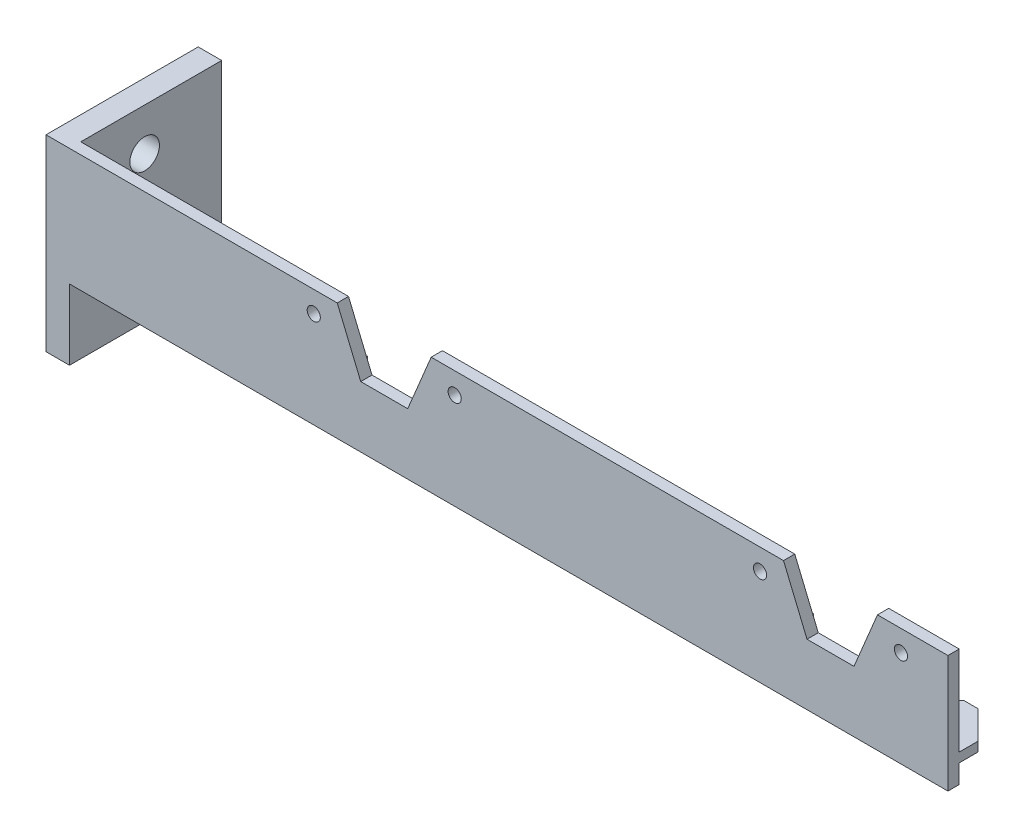
ISO-10303-21;
HEADER;
FILE_DESCRIPTION(('STEP AP214'),'2;1');
FILE_NAME('part.step','',(''),(''),'','','');
FILE_SCHEMA(('AUTOMOTIVE_DESIGN { 1 0 10303 214 1 1 1 1 }'));
ENDSEC;
DATA;
#1=APPLICATION_CONTEXT('core data for automotive mechanical design processes');
#2=APPLICATION_PROTOCOL_DEFINITION('international standard','automotive_design',2000,#1);
#3=PRODUCT_CONTEXT('',#1,'mechanical');
#4=PRODUCT('Part','Part','',(#3));
#5=PRODUCT_RELATED_PRODUCT_CATEGORY('part','',(#4));
#6=PRODUCT_DEFINITION_FORMATION('','',#4);
#7=PRODUCT_DEFINITION_CONTEXT('part definition',#1,'design');
#8=PRODUCT_DEFINITION('design','',#6,#7);
#9=PRODUCT_DEFINITION_SHAPE('','',#8);
#10=(LENGTH_UNIT() NAMED_UNIT(*) SI_UNIT(.MILLI.,.METRE.));
#11=(NAMED_UNIT(*) PLANE_ANGLE_UNIT() SI_UNIT($,.RADIAN.));
#12=(NAMED_UNIT(*) SI_UNIT($,.STERADIAN.) SOLID_ANGLE_UNIT());
#13=UNCERTAINTY_MEASURE_WITH_UNIT(LENGTH_MEASURE(1.E-05),#10,'distance_accuracy_value','');
#14=(GEOMETRIC_REPRESENTATION_CONTEXT(3) GLOBAL_UNCERTAINTY_ASSIGNED_CONTEXT((#13)) GLOBAL_UNIT_ASSIGNED_CONTEXT((#10,
#11,#12)) REPRESENTATION_CONTEXT('',''));
#15=CARTESIAN_POINT('',(0.,0.,0.));
#16=DIRECTION('',(0.,0.,1.));
#17=DIRECTION('',(1.,0.,0.));
#18=AXIS2_PLACEMENT_3D('',#15,#16,#17);
#19=CARTESIAN_POINT('',(202.198039027186,5.99999999999997,-10.));
#20=DIRECTION('',(0.,-1.,0.));
#21=DIRECTION('',(1.,0.,0.));
#22=AXIS2_PLACEMENT_3D('',#19,#20,#21);
#23=PLANE('',#22);
#24=DIRECTION('',(0.,0.,-1.));
#25=VECTOR('',#24,1.);
#26=CARTESIAN_POINT('',(62.,5.99999999999999,-10.));
#27=LINE('',#26,#25);
#28=CARTESIAN_POINT('',(62.,5.99999999999999,0.));
#29=VERTEX_POINT('',#28);
#30=CARTESIAN_POINT('',(62.,5.99999999999999,-3.99999999999999));
#31=VERTEX_POINT('',#30);
#32=EDGE_CURVE('E323',#29,#31,#27,.T.);
#33=ORIENTED_EDGE('',*,*,#32,.T.);
#34=DIRECTION('',(0.707106781186548,0.,0.707106781186548));
#35=VECTOR('',#34,1.);
#36=CARTESIAN_POINT('',(56.,5.99999999999997,-10.));
#37=LINE('',#36,#35);
#38=CARTESIAN_POINT('',(56.,5.99999999999999,-10.));
#39=VERTEX_POINT('',#38);
#40=EDGE_CURVE('E11',#31,#39,#37,.F.);
#41=ORIENTED_EDGE('',*,*,#40,.T.);
#42=DIRECTION('',(-1.,0.,0.));
#43=VECTOR('',#42,1.);
#44=CARTESIAN_POINT('',(202.198039027186,5.99999999999997,-10.));
#45=LINE('',#44,#43);
#46=CARTESIAN_POINT('',(5.,6.,-10.));
#47=VERTEX_POINT('',#46);
#48=EDGE_CURVE('E300',#39,#47,#45,.T.);
#49=ORIENTED_EDGE('',*,*,#48,.T.);
#50=DIRECTION('',(0.,0.,1.));
#51=VECTOR('',#50,1.);
#52=CARTESIAN_POINT('',(5.,6.,-10.));
#53=LINE('',#52,#51);
#54=CARTESIAN_POINT('',(5.,6.,0.));
#55=VERTEX_POINT('',#54);
#56=EDGE_CURVE('E312',#47,#55,#53,.T.);
#57=ORIENTED_EDGE('',*,*,#56,.T.);
#58=DIRECTION('',(-1.,0.,0.));
#59=VECTOR('',#58,1.);
#60=CARTESIAN_POINT('',(202.198039027186,5.99999999999997,0.));
#61=LINE('',#60,#59);
#62=EDGE_CURVE('E309',#29,#55,#61,.T.);
#63=ORIENTED_EDGE('',*,*,#62,.F.);
#64=EDGE_LOOP('',(#33,#41,#49,#57,#63));
#65=FACE_BOUND('',#64,.T.);
#66=ADVANCED_FACE('F35',(#65),#23,.F.);
#67=DIRECTION('',(0.,0.,-1.));
#68=VECTOR('',#67,1.);
#69=CARTESIAN_POINT('',(157.,5.99999999999998,-10.));
#70=LINE('',#69,#68);
#71=CARTESIAN_POINT('',(157.,5.99999999999998,0.));
#72=VERTEX_POINT('',#71);
#73=CARTESIAN_POINT('',(157.,5.99999999999998,-3.99999999999994));
#74=VERTEX_POINT('',#73);
#75=EDGE_CURVE('E329',#72,#74,#70,.T.);
#76=ORIENTED_EDGE('',*,*,#75,.T.);
#77=DIRECTION('',(0.707106781186546,0.,0.707106781186549));
#78=VECTOR('',#77,1.);
#79=CARTESIAN_POINT('',(151.,5.99999999999997,-10.));
#80=LINE('',#79,#78);
#81=CARTESIAN_POINT('',(151.,5.99999999999998,-10.));
#82=VERTEX_POINT('',#81);
#83=EDGE_CURVE('E349',#74,#82,#80,.F.);
#84=ORIENTED_EDGE('',*,*,#83,.T.);
#85=CARTESIAN_POINT('',(88.,5.99999999999999,-10.));
#86=VERTEX_POINT('',#85);
#87=EDGE_CURVE('E299',#82,#86,#45,.T.);
#88=ORIENTED_EDGE('',*,*,#87,.T.);
#89=DIRECTION('',(0.707106781186544,0.,-0.707106781186551));
#90=VECTOR('',#89,1.);
#91=CARTESIAN_POINT('',(88.,5.99999999999997,-10.));
#92=LINE('',#91,#90);
#93=CARTESIAN_POINT('',(82.,5.99999999999999,-3.99999999999994));
#94=VERTEX_POINT('',#93);
#95=EDGE_CURVE('E353',#86,#94,#92,.F.);
#96=ORIENTED_EDGE('',*,*,#95,.T.);
#97=DIRECTION('',(0.,0.,1.));
#98=VECTOR('',#97,1.);
#99=CARTESIAN_POINT('',(82.,5.99999999999999,-10.));
#100=LINE('',#99,#98);
#101=CARTESIAN_POINT('',(82.,5.99999999999998,0.));
#102=VERTEX_POINT('',#101);
#103=EDGE_CURVE('E327',#94,#102,#100,.T.);
#104=ORIENTED_EDGE('',*,*,#103,.T.);
#105=EDGE_CURVE('E308',#72,#102,#61,.T.);
#106=ORIENTED_EDGE('',*,*,#105,.F.);
#107=EDGE_LOOP('',(#76,#84,#88,#96,#104,#106));
#108=FACE_BOUND('',#107,.T.);
#109=ADVANCED_FACE('F593',(#108),#23,.F.);
#110=CARTESIAN_POINT('',(202.198039027186,5.99999999999997,-10.));
#111=DIRECTION('',(0.,0.,1.));
#112=DIRECTION('',(0.,-1.,0.));
#113=AXIS2_PLACEMENT_3D('',#110,#111,#112);
#114=PLANE('',#113);
#115=ORIENTED_EDGE('',*,*,#48,.F.);
#116=DIRECTION('',(0.,-1.,0.));
#117=VECTOR('',#116,1.);
#118=CARTESIAN_POINT('',(56.,5.99999999999997,-10.));
#119=LINE('',#118,#117);
#120=CARTESIAN_POINT('',(56.,3.99999999999999,-10.));
#121=VERTEX_POINT('',#120);
#122=EDGE_CURVE('E345',#39,#121,#119,.T.);
#123=ORIENTED_EDGE('',*,*,#122,.T.);
#124=DIRECTION('',(-1.,0.,0.));
#125=VECTOR('',#124,1.);
#126=CARTESIAN_POINT('',(202.198039027186,3.99999999999997,-10.));
#127=LINE('',#126,#125);
#128=CARTESIAN_POINT('',(5.,4.,-10.));
#129=VERTEX_POINT('',#128);
#130=EDGE_CURVE('E286',#121,#129,#127,.T.);
#131=ORIENTED_EDGE('',*,*,#130,.T.);
#132=DIRECTION('',(0.,1.,0.));
#133=VECTOR('',#132,1.);
#134=CARTESIAN_POINT('',(5.,6.,-10.));
#135=LINE('',#134,#133);
#136=EDGE_CURVE('E316',#129,#47,#135,.T.);
#137=ORIENTED_EDGE('',*,*,#136,.T.);
#138=EDGE_LOOP('',(#115,#123,#131,#137));
#139=FACE_BOUND('',#138,.T.);
#140=ADVANCED_FACE('F599',(#139),#114,.F.);
#141=ORIENTED_EDGE('',*,*,#87,.F.);
#142=DIRECTION('',(0.,-1.,0.));
#143=VECTOR('',#142,1.);
#144=CARTESIAN_POINT('',(151.,5.99999999999997,-10.));
#145=LINE('',#144,#143);
#146=CARTESIAN_POINT('',(151.,3.99999999999998,-10.));
#147=VERTEX_POINT('',#146);
#148=EDGE_CURVE('E361',#82,#147,#145,.T.);
#149=ORIENTED_EDGE('',*,*,#148,.T.);
#150=CARTESIAN_POINT('',(88.,3.99999999999999,-10.));
#151=VERTEX_POINT('',#150);
#152=EDGE_CURVE('E285',#147,#151,#127,.T.);
#153=ORIENTED_EDGE('',*,*,#152,.T.);
#154=DIRECTION('',(0.,1.,0.));
#155=VECTOR('',#154,1.);
#156=CARTESIAN_POINT('',(88.,5.99999999999997,-10.));
#157=LINE('',#156,#155);
#158=EDGE_CURVE('E364',#151,#86,#157,.T.);
#159=ORIENTED_EDGE('',*,*,#158,.T.);
#160=EDGE_LOOP('',(#141,#149,#153,#159));
#161=FACE_BOUND('',#160,.T.);
#162=ADVANCED_FACE('F609',(#161),#114,.F.);
#163=CARTESIAN_POINT('',(202.198039027186,3.99999999999997,-10.));
#164=DIRECTION('',(0.,1.,0.));
#165=DIRECTION('',(0.,0.,1.));
#166=AXIS2_PLACEMENT_3D('',#163,#164,#165);
#167=PLANE('',#166);
#168=ORIENTED_EDGE('',*,*,#130,.F.);
#169=DIRECTION('',(-0.707106781186548,0.,-0.707106781186548));
#170=VECTOR('',#169,1.);
#171=CARTESIAN_POINT('',(56.,3.99999999999999,-10.));
#172=LINE('',#171,#170);
#173=CARTESIAN_POINT('',(62.,3.99999999999999,-4.));
#174=VERTEX_POINT('',#173);
#175=EDGE_CURVE('E58',#121,#174,#172,.F.);
#176=ORIENTED_EDGE('',*,*,#175,.T.);
#177=DIRECTION('',(0.,0.,1.));
#178=VECTOR('',#177,1.);
#179=CARTESIAN_POINT('',(62.,3.99999999999999,-10.));
#180=LINE('',#179,#178);
#181=CARTESIAN_POINT('',(62.,3.99999999999999,0.));
#182=VERTEX_POINT('',#181);
#183=EDGE_CURVE('E382',#174,#182,#180,.T.);
#184=ORIENTED_EDGE('',*,*,#183,.T.);
#185=DIRECTION('',(-1.,0.,0.));
#186=VECTOR('',#185,1.);
#187=CARTESIAN_POINT('',(202.198039027186,3.99999999999997,0.));
#188=LINE('',#187,#186);
#189=CARTESIAN_POINT('',(5.,3.99999999999997,0.));
#190=VERTEX_POINT('',#189);
#191=EDGE_CURVE('E275',#182,#190,#188,.T.);
#192=ORIENTED_EDGE('',*,*,#191,.T.);
#193=DIRECTION('',(0.,0.,-1.));
#194=VECTOR('',#193,1.);
#195=CARTESIAN_POINT('',(5.,4.,-10.));
#196=LINE('',#195,#194);
#197=EDGE_CURVE('E319',#190,#129,#196,.T.);
#198=ORIENTED_EDGE('',*,*,#197,.T.);
#199=EDGE_LOOP('',(#168,#176,#184,#192,#198));
#200=FACE_BOUND('',#199,.T.);
#201=ADVANCED_FACE('F828',(#200),#167,.F.);
#202=ORIENTED_EDGE('',*,*,#152,.F.);
#203=DIRECTION('',(-0.707106781186546,0.,-0.707106781186549));
#204=VECTOR('',#203,1.);
#205=CARTESIAN_POINT('',(151.,3.99999999999998,-10.));
#206=LINE('',#205,#204);
#207=CARTESIAN_POINT('',(157.,3.99999999999998,-3.99999999999994));
#208=VERTEX_POINT('',#207);
#209=EDGE_CURVE('E357',#147,#208,#206,.F.);
#210=ORIENTED_EDGE('',*,*,#209,.T.);
#211=DIRECTION('',(0.,0.,1.));
#212=VECTOR('',#211,1.);
#213=CARTESIAN_POINT('',(157.,3.99999999999998,-10.));
#214=LINE('',#213,#212);
#215=CARTESIAN_POINT('',(157.,3.99999999999998,0.));
#216=VERTEX_POINT('',#215);
#217=EDGE_CURVE('E254',#208,#216,#214,.T.);
#218=ORIENTED_EDGE('',*,*,#217,.T.);
#219=CARTESIAN_POINT('',(82.,3.99999999999999,0.));
#220=VERTEX_POINT('',#219);
#221=EDGE_CURVE('E273',#216,#220,#188,.T.);
#222=ORIENTED_EDGE('',*,*,#221,.T.);
#223=DIRECTION('',(0.,0.,-1.));
#224=VECTOR('',#223,1.);
#225=CARTESIAN_POINT('',(82.,3.99999999999999,-10.));
#226=LINE('',#225,#224);
#227=CARTESIAN_POINT('',(82.,3.99999999999999,-3.99999999999994));
#228=VERTEX_POINT('',#227);
#229=EDGE_CURVE('E384',#220,#228,#226,.T.);
#230=ORIENTED_EDGE('',*,*,#229,.T.);
#231=DIRECTION('',(-0.707106781186544,0.,0.707106781186551));
#232=VECTOR('',#231,1.);
#233=CARTESIAN_POINT('',(88.,3.99999999999999,-10.));
#234=LINE('',#233,#232);
#235=EDGE_CURVE('E359',#228,#151,#234,.F.);
#236=ORIENTED_EDGE('',*,*,#235,.T.);
#237=EDGE_LOOP('',(#202,#210,#218,#222,#230,#236));
#238=FACE_BOUND('',#237,.T.);
#239=ADVANCED_FACE('F664',(#238),#167,.F.);
#240=CARTESIAN_POINT('',(0.,0.,0.));
#241=DIRECTION('',(0.,0.,-1.));
#242=DIRECTION('',(-1.,0.,0.));
#243=AXIS2_PLACEMENT_3D('',#240,#241,#242);
#244=PLANE('',#243);
#245=ORIENTED_EDGE('',*,*,#105,.T.);
#246=DIRECTION('',(0.,1.,0.));
#247=VECTOR('',#246,1.);
#248=CARTESIAN_POINT('',(82.,-15.,0.));
#249=LINE('',#248,#247);
#250=EDGE_CURVE('E337',#220,#102,#249,.T.);
#251=ORIENTED_EDGE('',*,*,#250,.F.);
#252=ORIENTED_EDGE('',*,*,#221,.F.);
#253=DIRECTION('',(0.,1.,0.));
#254=VECTOR('',#253,1.);
#255=CARTESIAN_POINT('',(157.,-15.,0.));
#256=LINE('',#255,#254);
#257=EDGE_CURVE('E267',#216,#72,#256,.T.);
#258=ORIENTED_EDGE('',*,*,#257,.T.);
#259=EDGE_LOOP('',(#245,#251,#252,#258));
#260=FACE_BOUND('',#259,.T.);
#261=DIRECTION('',(0.,1.,0.));
#262=VECTOR('',#261,1.);
#263=CARTESIAN_POINT('',(192.,0.,0.));
#264=LINE('',#263,#262);
#265=CARTESIAN_POINT('',(192.,0.,0.));
#266=VERTEX_POINT('',#265);
#267=CARTESIAN_POINT('',(192.,3.99999999999997,0.));
#268=VERTEX_POINT('',#267);
#269=EDGE_CURVE('E413',#266,#268,#264,.T.);
#270=ORIENTED_EDGE('',*,*,#269,.F.);
#271=DIRECTION('',(1.,0.,0.));
#272=VECTOR('',#271,1.);
#273=CARTESIAN_POINT('',(0.,0.,0.));
#274=LINE('',#273,#272);
#275=CARTESIAN_POINT('',(5.,0.,0.));
#276=VERTEX_POINT('',#275);
#277=EDGE_CURVE('E416',#276,#266,#274,.T.);
#278=ORIENTED_EDGE('',*,*,#277,.F.);
#279=DIRECTION('',(0.,-1.,0.));
#280=VECTOR('',#279,1.);
#281=CARTESIAN_POINT('',(5.,0.,0.));
#282=LINE('',#281,#280);
#283=EDGE_CURVE('E397',#190,#276,#282,.T.);
#284=ORIENTED_EDGE('',*,*,#283,.F.);
#285=ORIENTED_EDGE('',*,*,#191,.F.);
#286=DIRECTION('',(0.,1.,0.));
#287=VECTOR('',#286,1.);
#288=CARTESIAN_POINT('',(62.,-15.,0.));
#289=LINE('',#288,#287);
#290=EDGE_CURVE('E333',#182,#29,#289,.T.);
#291=ORIENTED_EDGE('',*,*,#290,.T.);
#292=ORIENTED_EDGE('',*,*,#62,.T.);
#293=CARTESIAN_POINT('',(5.,25.,0.));
#294=VERTEX_POINT('',#293);
#295=EDGE_CURVE('E255',#294,#55,#282,.T.);
#296=ORIENTED_EDGE('',*,*,#295,.F.);
#297=DIRECTION('',(-1.,0.,0.));
#298=VECTOR('',#297,1.);
#299=CARTESIAN_POINT('',(0.,25.,0.));
#300=LINE('',#299,#298);
#301=CARTESIAN_POINT('',(62.,25.,0.));
#302=VERTEX_POINT('',#301);
#303=EDGE_CURVE('E412',#302,#294,#300,.T.);
#304=ORIENTED_EDGE('',*,*,#303,.F.);
#305=DIRECTION('',(0.384615384615384,-0.923076923076923,0.));
#306=VECTOR('',#305,1.);
#307=CARTESIAN_POINT('',(62.,25.,0.));
#308=LINE('',#307,#306);
#309=CARTESIAN_POINT('',(67.,13.,0.));
#310=VERTEX_POINT('',#309);
#311=EDGE_CURVE('E481',#302,#310,#308,.T.);
#312=ORIENTED_EDGE('',*,*,#311,.T.);
#313=DIRECTION('',(1.,0.,0.));
#314=VECTOR('',#313,1.);
#315=CARTESIAN_POINT('',(77.,13.,0.));
#316=LINE('',#315,#314);
#317=CARTESIAN_POINT('',(77.,13.,0.));
#318=VERTEX_POINT('',#317);
#319=EDGE_CURVE('E489',#310,#318,#316,.T.);
#320=ORIENTED_EDGE('',*,*,#319,.T.);
#321=DIRECTION('',(0.384615384615384,0.923076923076923,0.));
#322=VECTOR('',#321,1.);
#323=CARTESIAN_POINT('',(82.,25.,0.));
#324=LINE('',#323,#322);
#325=CARTESIAN_POINT('',(82.,25.,0.));
#326=VERTEX_POINT('',#325);
#327=EDGE_CURVE('E473',#318,#326,#324,.T.);
#328=ORIENTED_EDGE('',*,*,#327,.T.);
#329=CARTESIAN_POINT('',(157.,25.,0.));
#330=VERTEX_POINT('',#329);
#331=EDGE_CURVE('E411',#330,#326,#300,.T.);
#332=ORIENTED_EDGE('',*,*,#331,.F.);
#333=DIRECTION('',(0.384615384615385,-0.923076923076923,0.));
#334=VECTOR('',#333,1.);
#335=CARTESIAN_POINT('',(157.,25.,0.));
#336=LINE('',#335,#334);
#337=CARTESIAN_POINT('',(162.,13.,0.));
#338=VERTEX_POINT('',#337);
#339=EDGE_CURVE('E439',#330,#338,#336,.T.);
#340=ORIENTED_EDGE('',*,*,#339,.T.);
#341=DIRECTION('',(1.,0.,0.));
#342=VECTOR('',#341,1.);
#343=CARTESIAN_POINT('',(172.,13.,0.));
#344=LINE('',#343,#342);
#345=CARTESIAN_POINT('',(172.,13.,0.));
#346=VERTEX_POINT('',#345);
#347=EDGE_CURVE('E449',#338,#346,#344,.T.);
#348=ORIENTED_EDGE('',*,*,#347,.T.);
#349=DIRECTION('',(0.384615384615385,0.923076923076923,0.));
#350=VECTOR('',#349,1.);
#351=CARTESIAN_POINT('',(177.,25.,0.));
#352=LINE('',#351,#350);
#353=CARTESIAN_POINT('',(177.,25.,0.));
#354=VERTEX_POINT('',#353);
#355=EDGE_CURVE('E431',#346,#354,#352,.T.);
#356=ORIENTED_EDGE('',*,*,#355,.T.);
#357=CARTESIAN_POINT('',(192.,25.,0.));
#358=VERTEX_POINT('',#357);
#359=EDGE_CURVE('E407',#358,#354,#300,.T.);
#360=ORIENTED_EDGE('',*,*,#359,.F.);
#361=CARTESIAN_POINT('',(192.,5.99999999999997,0.));
#362=VERTEX_POINT('',#361);
#363=EDGE_CURVE('E415',#362,#358,#264,.T.);
#364=ORIENTED_EDGE('',*,*,#363,.F.);
#365=CARTESIAN_POINT('',(177.,5.99999999999997,0.));
#366=VERTEX_POINT('',#365);
#367=EDGE_CURVE('E266',#362,#366,#61,.T.);
#368=ORIENTED_EDGE('',*,*,#367,.T.);
#369=DIRECTION('',(0.,1.,0.));
#370=VECTOR('',#369,1.);
#371=CARTESIAN_POINT('',(177.,-15.,0.));
#372=LINE('',#371,#370);
#373=CARTESIAN_POINT('',(177.,3.99999999999997,0.));
#374=VERTEX_POINT('',#373);
#375=EDGE_CURVE('E247',#374,#366,#372,.T.);
#376=ORIENTED_EDGE('',*,*,#375,.F.);
#377=EDGE_CURVE('E262',#268,#374,#188,.T.);
#378=ORIENTED_EDGE('',*,*,#377,.F.);
#379=EDGE_LOOP('',(#270,#278,#284,#285,#291,#292,#296,#304,#312,#320,#328,#332,#340,#348,#356,
#360,#364,#368,#376,#378));
#380=FACE_BOUND('',#379,.T.);
#381=CARTESIAN_POINT('',(182.,20.5,0.));
#382=DIRECTION('',(0.,0.,1.));
#383=DIRECTION('',(1.,0.,0.));
#384=AXIS2_PLACEMENT_3D('',#381,#382,#383);
#385=CIRCLE('',#384,1.4);
#386=CARTESIAN_POINT('',(183.4,20.5,0.));
#387=VERTEX_POINT('',#386);
#388=EDGE_CURVE('E457',#387,#387,#385,.T.);
#389=ORIENTED_EDGE('',*,*,#388,.T.);
#390=EDGE_LOOP('',(#389));
#391=FACE_BOUND('',#390,.T.);
#392=CARTESIAN_POINT('',(152.,20.5,0.));
#393=DIRECTION('',(0.,0.,1.));
#394=DIRECTION('',(-1.,0.,0.));
#395=AXIS2_PLACEMENT_3D('',#392,#393,#394);
#396=CIRCLE('',#395,1.39999999999997);
#397=CARTESIAN_POINT('',(150.6,20.5,0.));
#398=VERTEX_POINT('',#397);
#399=EDGE_CURVE('E496',#398,#398,#396,.T.);
#400=ORIENTED_EDGE('',*,*,#399,.T.);
#401=EDGE_LOOP('',(#400));
#402=FACE_BOUND('',#401,.T.);
#403=CARTESIAN_POINT('',(87.,20.5,0.));
#404=DIRECTION('',(0.,0.,1.));
#405=DIRECTION('',(1.,0.,0.));
#406=AXIS2_PLACEMENT_3D('',#403,#404,#405);
#407=CIRCLE('',#406,1.4);
#408=CARTESIAN_POINT('',(88.4,20.5,0.));
#409=VERTEX_POINT('',#408);
#410=EDGE_CURVE('E465',#409,#409,#407,.T.);
#411=ORIENTED_EDGE('',*,*,#410,.T.);
#412=EDGE_LOOP('',(#411));
#413=FACE_BOUND('',#412,.T.);
#414=CARTESIAN_POINT('',(57.,20.5,0.));
#415=DIRECTION('',(0.,0.,1.));
#416=DIRECTION('',(-1.,0.,0.));
#417=AXIS2_PLACEMENT_3D('',#414,#415,#416);
#418=CIRCLE('',#417,1.4);
#419=CARTESIAN_POINT('',(55.6,20.5,0.));
#420=VERTEX_POINT('',#419);
#421=EDGE_CURVE('E466',#420,#420,#418,.T.);
#422=ORIENTED_EDGE('',*,*,#421,.T.);
#423=EDGE_LOOP('',(#422));
#424=FACE_BOUND('',#423,.T.);
#425=ADVANCED_FACE('F260',(#260,#380,#391,#402,#413,#424),#244,.T.);
#426=CARTESIAN_POINT('',(5.,25.,42.7112887414928));
#427=DIRECTION('',(1.,0.,0.));
#428=DIRECTION('',(0.,1.,0.));
#429=AXIS2_PLACEMENT_3D('',#426,#427,#428);
#430=PLANE('',#429);
#431=CARTESIAN_POINT('',(5.,16.,-13.6));
#432=DIRECTION('',(1.,0.,0.));
#433=DIRECTION('',(0.,1.,0.));
#434=AXIS2_PLACEMENT_3D('',#431,#432,#433);
#435=CIRCLE('',#434,3.15);
#436=CARTESIAN_POINT('',(5.,19.15,-13.6));
#437=VERTEX_POINT('',#436);
#438=EDGE_CURVE('E388',#437,#437,#435,.T.);
#439=ORIENTED_EDGE('',*,*,#438,.F.);
#440=EDGE_LOOP('',(#439));
#441=FACE_BOUND('',#440,.T.);
#442=CARTESIAN_POINT('',(5.,-6.,-13.6));
#443=DIRECTION('',(1.,0.,0.));
#444=DIRECTION('',(0.,1.,0.));
#445=AXIS2_PLACEMENT_3D('',#442,#443,#444);
#446=CIRCLE('',#445,3.15);
#447=CARTESIAN_POINT('',(5.,-2.85,-13.6));
#448=VERTEX_POINT('',#447);
#449=EDGE_CURVE('E392',#448,#448,#446,.T.);
#450=ORIENTED_EDGE('',*,*,#449,.F.);
#451=EDGE_LOOP('',(#450));
#452=FACE_BOUND('',#451,.T.);
#453=ORIENTED_EDGE('',*,*,#295,.T.);
#454=ORIENTED_EDGE('',*,*,#56,.F.);
#455=ORIENTED_EDGE('',*,*,#136,.F.);
#456=ORIENTED_EDGE('',*,*,#197,.F.);
#457=ORIENTED_EDGE('',*,*,#283,.T.);
#458=DIRECTION('',(0.,0.,-1.));
#459=VECTOR('',#458,1.);
#460=CARTESIAN_POINT('',(5.,0.,2.4));
#461=LINE('',#460,#459);
#462=CARTESIAN_POINT('',(5.,0.,2.4));
#463=VERTEX_POINT('',#462);
#464=EDGE_CURVE('E458',#463,#276,#461,.T.);
#465=ORIENTED_EDGE('',*,*,#464,.F.);
#466=DIRECTION('',(0.,1.,0.));
#467=VECTOR('',#466,1.);
#468=CARTESIAN_POINT('',(5.,25.,2.4));
#469=LINE('',#468,#467);
#470=CARTESIAN_POINT('',(4.99999999999999,-15.,2.4));
#471=VERTEX_POINT('',#470);
#472=EDGE_CURVE('E508',#471,#463,#469,.T.);
#473=ORIENTED_EDGE('',*,*,#472,.F.);
#474=DIRECTION('',(0.,0.,-1.));
#475=VECTOR('',#474,1.);
#476=CARTESIAN_POINT('',(4.99999999999999,-15.,42.7112887414928));
#477=LINE('',#476,#475);
#478=CARTESIAN_POINT('',(4.99999999999999,-15.,-30.));
#479=VERTEX_POINT('',#478);
#480=EDGE_CURVE('E509',#471,#479,#477,.T.);
#481=ORIENTED_EDGE('',*,*,#480,.T.);
#482=DIRECTION('',(0.,-1.,0.));
#483=VECTOR('',#482,1.);
#484=CARTESIAN_POINT('',(5.,25.,-30.));
#485=LINE('',#484,#483);
#486=CARTESIAN_POINT('',(5.,25.,-30.));
#487=VERTEX_POINT('',#486);
#488=EDGE_CURVE('E391',#487,#479,#485,.T.);
#489=ORIENTED_EDGE('',*,*,#488,.F.);
#490=DIRECTION('',(0.,0.,-1.));
#491=VECTOR('',#490,1.);
#492=CARTESIAN_POINT('',(5.,25.,42.7112887414928));
#493=LINE('',#492,#491);
#494=EDGE_CURVE('E514',#294,#487,#493,.T.);
#495=ORIENTED_EDGE('',*,*,#494,.F.);
#496=EDGE_LOOP('',(#453,#454,#455,#456,#457,#465,#473,#481,#489,#495));
#497=FACE_BOUND('',#496,.T.);
#498=ADVANCED_FACE('F559',(#441,#452,#497),#430,.T.);
#499=CARTESIAN_POINT('',(0.,25.,2.4));
#500=DIRECTION('',(0.,-1.,0.));
#501=DIRECTION('',(0.,0.,-1.));
#502=AXIS2_PLACEMENT_3D('',#499,#500,#501);
#503=PLANE('',#502);
#504=ORIENTED_EDGE('',*,*,#331,.T.);
#505=DIRECTION('',(0.,0.,1.));
#506=VECTOR('',#505,1.);
#507=CARTESIAN_POINT('',(82.,25.,0.));
#508=LINE('',#507,#506);
#509=CARTESIAN_POINT('',(82.,25.,2.4));
#510=VERTEX_POINT('',#509);
#511=EDGE_CURVE('E446',#326,#510,#508,.T.);
#512=ORIENTED_EDGE('',*,*,#511,.T.);
#513=DIRECTION('',(-1.,0.,0.));
#514=VECTOR('',#513,1.);
#515=CARTESIAN_POINT('',(0.,25.,2.4));
#516=LINE('',#515,#514);
#517=CARTESIAN_POINT('',(157.,25.,2.4));
#518=VERTEX_POINT('',#517);
#519=EDGE_CURVE('E421',#518,#510,#516,.T.);
#520=ORIENTED_EDGE('',*,*,#519,.F.);
#521=DIRECTION('',(0.,0.,1.));
#522=VECTOR('',#521,1.);
#523=CARTESIAN_POINT('',(157.,25.,0.));
#524=LINE('',#523,#522);
#525=EDGE_CURVE('E428',#330,#518,#524,.T.);
#526=ORIENTED_EDGE('',*,*,#525,.F.);
#527=EDGE_LOOP('',(#504,#512,#520,#526));
#528=FACE_BOUND('',#527,.T.);
#529=ADVANCED_FACE('F564',(#528),#503,.F.);
#530=ORIENTED_EDGE('',*,*,#359,.T.);
#531=DIRECTION('',(0.,0.,1.));
#532=VECTOR('',#531,1.);
#533=CARTESIAN_POINT('',(177.,25.,0.));
#534=LINE('',#533,#532);
#535=CARTESIAN_POINT('',(177.,25.,2.4));
#536=VERTEX_POINT('',#535);
#537=EDGE_CURVE('E418',#354,#536,#534,.T.);
#538=ORIENTED_EDGE('',*,*,#537,.T.);
#539=CARTESIAN_POINT('',(192.,25.,2.4));
#540=VERTEX_POINT('',#539);
#541=EDGE_CURVE('E406',#540,#536,#516,.T.);
#542=ORIENTED_EDGE('',*,*,#541,.F.);
#543=DIRECTION('',(0.,0.,-1.));
#544=VECTOR('',#543,1.);
#545=CARTESIAN_POINT('',(192.,25.,2.4));
#546=LINE('',#545,#544);
#547=EDGE_CURVE('E401',#540,#358,#546,.T.);
#548=ORIENTED_EDGE('',*,*,#547,.T.);
#549=EDGE_LOOP('',(#530,#538,#542,#548));
#550=FACE_BOUND('',#549,.T.);
#551=ADVANCED_FACE('F539',(#550),#503,.F.);
#552=CARTESIAN_POINT('',(0.,0.,2.4));
#553=DIRECTION('',(1.,0.,0.));
#554=DIRECTION('',(0.,0.,-1.));
#555=AXIS2_PLACEMENT_3D('',#552,#553,#554);
#556=PLANE('',#555);
#557=CARTESIAN_POINT('',(0.,16.,-13.6));
#558=DIRECTION('',(-1.,0.,0.));
#559=DIRECTION('',(0.,0.,1.));
#560=AXIS2_PLACEMENT_3D('',#557,#558,#559);
#561=CIRCLE('',#560,3.15);
#562=CARTESIAN_POINT('',(0.,16.,-10.45));
#563=VERTEX_POINT('',#562);
#564=EDGE_CURVE('E395',#563,#563,#561,.T.);
#565=ORIENTED_EDGE('',*,*,#564,.F.);
#566=EDGE_LOOP('',(#565));
#567=FACE_BOUND('',#566,.T.);
#568=CARTESIAN_POINT('',(0.,-6.,-13.6));
#569=DIRECTION('',(-1.,0.,0.));
#570=DIRECTION('',(0.,0.,1.));
#571=AXIS2_PLACEMENT_3D('',#568,#569,#570);
#572=CIRCLE('',#571,3.15);
#573=CARTESIAN_POINT('',(0.,-6.,-10.45));
#574=VERTEX_POINT('',#573);
#575=EDGE_CURVE('E325',#574,#574,#572,.T.);
#576=ORIENTED_EDGE('',*,*,#575,.F.);
#577=EDGE_LOOP('',(#576));
#578=FACE_BOUND('',#577,.T.);
#579=DIRECTION('',(0.,0.,-1.));
#580=VECTOR('',#579,1.);
#581=CARTESIAN_POINT('',(0.,25.,2.4));
#582=LINE('',#581,#580);
#583=CARTESIAN_POINT('',(0.,25.,2.4));
#584=VERTEX_POINT('',#583);
#585=CARTESIAN_POINT('',(0.,25.,-30.));
#586=VERTEX_POINT('',#585);
#587=EDGE_CURVE('E404',#584,#586,#582,.T.);
#588=ORIENTED_EDGE('',*,*,#587,.T.);
#589=DIRECTION('',(0.,1.,0.));
#590=VECTOR('',#589,1.);
#591=CARTESIAN_POINT('',(0.,25.,-30.));
#592=LINE('',#591,#590);
#593=CARTESIAN_POINT('',(0.,-15.,-30.));
#594=VERTEX_POINT('',#593);
#595=EDGE_CURVE('E520',#594,#586,#592,.T.);
#596=ORIENTED_EDGE('',*,*,#595,.F.);
#597=DIRECTION('',(0.,0.,-1.));
#598=VECTOR('',#597,1.);
#599=CARTESIAN_POINT('',(0.,-15.,42.7112887414928));
#600=LINE('',#599,#598);
#601=CARTESIAN_POINT('',(0.,-15.,2.4));
#602=VERTEX_POINT('',#601);
#603=EDGE_CURVE('E511',#602,#594,#600,.T.);
#604=ORIENTED_EDGE('',*,*,#603,.F.);
#605=DIRECTION('',(0.,-1.,0.));
#606=VECTOR('',#605,1.);
#607=CARTESIAN_POINT('',(0.,0.,2.4));
#608=LINE('',#607,#606);
#609=EDGE_CURVE('E410',#584,#602,#608,.T.);
#610=ORIENTED_EDGE('',*,*,#609,.F.);
#611=EDGE_LOOP('',(#588,#596,#604,#610));
#612=FACE_BOUND('',#611,.T.);
#613=ADVANCED_FACE('F535',(#567,#578,#612),#556,.F.);
#614=CARTESIAN_POINT('',(0.,0.,2.4));
#615=DIRECTION('',(0.,1.,0.));
#616=DIRECTION('',(0.,0.,1.));
#617=AXIS2_PLACEMENT_3D('',#614,#615,#616);
#618=PLANE('',#617);
#619=DIRECTION('',(1.,0.,0.));
#620=VECTOR('',#619,1.);
#621=CARTESIAN_POINT('',(0.,0.,2.4));
#622=LINE('',#621,#620);
#623=CARTESIAN_POINT('',(192.,0.,2.4));
#624=VERTEX_POINT('',#623);
#625=EDGE_CURVE('E425',#463,#624,#622,.T.);
#626=ORIENTED_EDGE('',*,*,#625,.F.);
#627=ORIENTED_EDGE('',*,*,#464,.T.);
#628=ORIENTED_EDGE('',*,*,#277,.T.);
#629=DIRECTION('',(0.,0.,-1.));
#630=VECTOR('',#629,1.);
#631=CARTESIAN_POINT('',(192.,0.,2.4));
#632=LINE('',#631,#630);
#633=EDGE_CURVE('E398',#624,#266,#632,.T.);
#634=ORIENTED_EDGE('',*,*,#633,.F.);
#635=EDGE_LOOP('',(#626,#627,#628,#634));
#636=FACE_BOUND('',#635,.T.);
#637=ADVANCED_FACE('F538',(#636),#618,.F.);
#638=CARTESIAN_POINT('',(192.,0.,2.4));
#639=DIRECTION('',(-1.,0.,0.));
#640=DIRECTION('',(0.,0.,1.));
#641=AXIS2_PLACEMENT_3D('',#638,#639,#640);
#642=PLANE('',#641);
#643=DIRECTION('',(0.,0.,1.));
#644=VECTOR('',#643,1.);
#645=CARTESIAN_POINT('',(192.,3.99999999999997,-10.));
#646=LINE('',#645,#644);
#647=CARTESIAN_POINT('',(192.,3.99999999999997,-3.99999999999994));
#648=VERTEX_POINT('',#647);
#649=EDGE_CURVE('E271',#648,#268,#646,.T.);
#650=ORIENTED_EDGE('',*,*,#649,.F.);
#651=DIRECTION('',(0.,1.,0.));
#652=VECTOR('',#651,1.);
#653=CARTESIAN_POINT('',(192.,0.,-3.99999999999994));
#654=LINE('',#653,#652);
#655=CARTESIAN_POINT('',(192.,5.99999999999997,-3.99999999999994));
#656=VERTEX_POINT('',#655);
#657=EDGE_CURVE('E367',#648,#656,#654,.T.);
#658=ORIENTED_EDGE('',*,*,#657,.T.);
#659=DIRECTION('',(0.,0.,-1.));
#660=VECTOR('',#659,1.);
#661=CARTESIAN_POINT('',(192.,5.99999999999997,-10.));
#662=LINE('',#661,#660);
#663=EDGE_CURVE('E272',#362,#656,#662,.T.);
#664=ORIENTED_EDGE('',*,*,#663,.F.);
#665=ORIENTED_EDGE('',*,*,#363,.T.);
#666=ORIENTED_EDGE('',*,*,#547,.F.);
#667=DIRECTION('',(0.,1.,0.));
#668=VECTOR('',#667,1.);
#669=CARTESIAN_POINT('',(192.,0.,2.4));
#670=LINE('',#669,#668);
#671=EDGE_CURVE('E423',#624,#540,#670,.T.);
#672=ORIENTED_EDGE('',*,*,#671,.F.);
#673=ORIENTED_EDGE('',*,*,#633,.T.);
#674=ORIENTED_EDGE('',*,*,#269,.T.);
#675=EDGE_LOOP('',(#650,#658,#664,#665,#666,#672,#673,#674));
#676=FACE_BOUND('',#675,.T.);
#677=ADVANCED_FACE('F657',(#676),#642,.F.);
#678=ORIENTED_EDGE('',*,*,#303,.T.);
#679=ORIENTED_EDGE('',*,*,#494,.T.);
#680=DIRECTION('',(1.,0.,0.));
#681=VECTOR('',#680,1.);
#682=CARTESIAN_POINT('',(5.,25.,-30.));
#683=LINE('',#682,#681);
#684=EDGE_CURVE('E512',#586,#487,#683,.T.);
#685=ORIENTED_EDGE('',*,*,#684,.F.);
#686=ORIENTED_EDGE('',*,*,#587,.F.);
#687=CARTESIAN_POINT('',(62.,25.,2.4));
#688=VERTEX_POINT('',#687);
#689=EDGE_CURVE('E422',#688,#584,#516,.T.);
#690=ORIENTED_EDGE('',*,*,#689,.F.);
#691=DIRECTION('',(0.,0.,1.));
#692=VECTOR('',#691,1.);
#693=CARTESIAN_POINT('',(62.,25.,0.));
#694=LINE('',#693,#692);
#695=EDGE_CURVE('E470',#302,#688,#694,.T.);
#696=ORIENTED_EDGE('',*,*,#695,.F.);
#697=EDGE_LOOP('',(#678,#679,#685,#686,#690,#696));
#698=FACE_BOUND('',#697,.T.);
#699=ADVANCED_FACE('F555',(#698),#503,.F.);
#700=CARTESIAN_POINT('',(0.,0.,2.4));
#701=DIRECTION('',(0.,0.,-1.));
#702=DIRECTION('',(-1.,0.,0.));
#703=AXIS2_PLACEMENT_3D('',#700,#701,#702);
#704=PLANE('',#703);
#705=CARTESIAN_POINT('',(182.,20.5,2.4));
#706=DIRECTION('',(0.,0.,1.));
#707=DIRECTION('',(1.,0.,0.));
#708=AXIS2_PLACEMENT_3D('',#705,#706,#707);
#709=CIRCLE('',#708,1.4);
#710=CARTESIAN_POINT('',(183.4,20.5,2.4));
#711=VERTEX_POINT('',#710);
#712=EDGE_CURVE('E454',#711,#711,#709,.T.);
#713=ORIENTED_EDGE('',*,*,#712,.F.);
#714=EDGE_LOOP('',(#713));
#715=FACE_BOUND('',#714,.T.);
#716=CARTESIAN_POINT('',(87.,20.5,2.4));
#717=DIRECTION('',(0.,0.,1.));
#718=DIRECTION('',(1.,0.,0.));
#719=AXIS2_PLACEMENT_3D('',#716,#717,#718);
#720=CIRCLE('',#719,1.4);
#721=CARTESIAN_POINT('',(88.4,20.5,2.4));
#722=VERTEX_POINT('',#721);
#723=EDGE_CURVE('E462',#722,#722,#720,.T.);
#724=ORIENTED_EDGE('',*,*,#723,.F.);
#725=EDGE_LOOP('',(#724));
#726=FACE_BOUND('',#725,.T.);
#727=CARTESIAN_POINT('',(57.,20.5,2.4));
#728=DIRECTION('',(0.,0.,1.));
#729=DIRECTION('',(-1.,0.,0.));
#730=AXIS2_PLACEMENT_3D('',#727,#728,#729);
#731=CIRCLE('',#730,1.4);
#732=CARTESIAN_POINT('',(55.6,20.5,2.4));
#733=VERTEX_POINT('',#732);
#734=EDGE_CURVE('E499',#733,#733,#731,.T.);
#735=ORIENTED_EDGE('',*,*,#734,.F.);
#736=EDGE_LOOP('',(#735));
#737=FACE_BOUND('',#736,.T.);
#738=CARTESIAN_POINT('',(152.,20.5,2.4));
#739=DIRECTION('',(0.,0.,1.));
#740=DIRECTION('',(-1.,0.,0.));
#741=AXIS2_PLACEMENT_3D('',#738,#739,#740);
#742=CIRCLE('',#741,1.39999999999997);
#743=CARTESIAN_POINT('',(150.6,20.5,2.4));
#744=VERTEX_POINT('',#743);
#745=EDGE_CURVE('E461',#744,#744,#742,.T.);
#746=ORIENTED_EDGE('',*,*,#745,.F.);
#747=EDGE_LOOP('',(#746));
#748=FACE_BOUND('',#747,.T.);
#749=ORIENTED_EDGE('',*,*,#689,.T.);
#750=ORIENTED_EDGE('',*,*,#609,.T.);
#751=DIRECTION('',(1.,0.,0.));
#752=VECTOR('',#751,1.);
#753=CARTESIAN_POINT('',(4.99999999999999,-15.,2.4));
#754=LINE('',#753,#752);
#755=EDGE_CURVE('E506',#602,#471,#754,.T.);
#756=ORIENTED_EDGE('',*,*,#755,.T.);
#757=ORIENTED_EDGE('',*,*,#472,.T.);
#758=ORIENTED_EDGE('',*,*,#625,.T.);
#759=ORIENTED_EDGE('',*,*,#671,.T.);
#760=ORIENTED_EDGE('',*,*,#541,.T.);
#761=DIRECTION('',(0.384615384615385,0.923076923076923,0.));
#762=VECTOR('',#761,1.);
#763=CARTESIAN_POINT('',(177.,25.,2.4));
#764=LINE('',#763,#762);
#765=CARTESIAN_POINT('',(172.,13.,2.4));
#766=VERTEX_POINT('',#765);
#767=EDGE_CURVE('E437',#766,#536,#764,.T.);
#768=ORIENTED_EDGE('',*,*,#767,.F.);
#769=DIRECTION('',(1.,0.,0.));
#770=VECTOR('',#769,1.);
#771=CARTESIAN_POINT('',(172.,13.,2.4));
#772=LINE('',#771,#770);
#773=CARTESIAN_POINT('',(162.,13.,2.4));
#774=VERTEX_POINT('',#773);
#775=EDGE_CURVE('E440',#774,#766,#772,.T.);
#776=ORIENTED_EDGE('',*,*,#775,.F.);
#777=DIRECTION('',(0.384615384615385,-0.923076923076923,0.));
#778=VECTOR('',#777,1.);
#779=CARTESIAN_POINT('',(157.,25.,2.4));
#780=LINE('',#779,#778);
#781=EDGE_CURVE('E443',#518,#774,#780,.T.);
#782=ORIENTED_EDGE('',*,*,#781,.F.);
#783=ORIENTED_EDGE('',*,*,#519,.T.);
#784=DIRECTION('',(0.384615384615384,0.923076923076923,0.));
#785=VECTOR('',#784,1.);
#786=CARTESIAN_POINT('',(82.,25.,2.4));
#787=LINE('',#786,#785);
#788=CARTESIAN_POINT('',(77.,13.,2.4));
#789=VERTEX_POINT('',#788);
#790=EDGE_CURVE('E479',#789,#510,#787,.T.);
#791=ORIENTED_EDGE('',*,*,#790,.F.);
#792=DIRECTION('',(1.,0.,0.));
#793=VECTOR('',#792,1.);
#794=CARTESIAN_POINT('',(77.,13.,2.4));
#795=LINE('',#794,#793);
#796=CARTESIAN_POINT('',(67.,13.,2.4));
#797=VERTEX_POINT('',#796);
#798=EDGE_CURVE('E482',#797,#789,#795,.T.);
#799=ORIENTED_EDGE('',*,*,#798,.F.);
#800=DIRECTION('',(0.384615384615384,-0.923076923076923,0.));
#801=VECTOR('',#800,1.);
#802=CARTESIAN_POINT('',(62.,25.,2.4));
#803=LINE('',#802,#801);
#804=EDGE_CURVE('E469',#688,#797,#803,.T.);
#805=ORIENTED_EDGE('',*,*,#804,.F.);
#806=EDGE_LOOP('',(#749,#750,#756,#757,#758,#759,#760,#768,#776,#782,#783,#791,#799,#805));
#807=FACE_BOUND('',#806,.T.);
#808=ADVANCED_FACE('F573',(#715,#726,#737,#748,#807),#704,.F.);
#809=CARTESIAN_POINT('',(177.,25.,0.));
#810=DIRECTION('',(0.923076923076923,-0.384615384615385,0.));
#811=DIRECTION('',(0.384615384615385,0.923076923076923,0.));
#812=AXIS2_PLACEMENT_3D('',#809,#810,#811);
#813=PLANE('',#812);
#814=ORIENTED_EDGE('',*,*,#767,.T.);
#815=ORIENTED_EDGE('',*,*,#537,.F.);
#816=ORIENTED_EDGE('',*,*,#355,.F.);
#817=DIRECTION('',(0.,0.,1.));
#818=VECTOR('',#817,1.);
#819=CARTESIAN_POINT('',(172.,13.,0.));
#820=LINE('',#819,#818);
#821=EDGE_CURVE('E433',#346,#766,#820,.T.);
#822=ORIENTED_EDGE('',*,*,#821,.T.);
#823=EDGE_LOOP('',(#814,#815,#816,#822));
#824=FACE_BOUND('',#823,.T.);
#825=ADVANCED_FACE('F648',(#824),#813,.F.);
#826=CARTESIAN_POINT('',(172.,13.,0.));
#827=DIRECTION('',(0.,-1.,0.));
#828=DIRECTION('',(1.,0.,0.));
#829=AXIS2_PLACEMENT_3D('',#826,#827,#828);
#830=PLANE('',#829);
#831=ORIENTED_EDGE('',*,*,#775,.T.);
#832=ORIENTED_EDGE('',*,*,#821,.F.);
#833=ORIENTED_EDGE('',*,*,#347,.F.);
#834=DIRECTION('',(0.,0.,1.));
#835=VECTOR('',#834,1.);
#836=CARTESIAN_POINT('',(162.,13.,0.));
#837=LINE('',#836,#835);
#838=EDGE_CURVE('E430',#338,#774,#837,.T.);
#839=ORIENTED_EDGE('',*,*,#838,.T.);
#840=EDGE_LOOP('',(#831,#832,#833,#839));
#841=FACE_BOUND('',#840,.T.);
#842=ADVANCED_FACE('F640',(#841),#830,.F.);
#843=CARTESIAN_POINT('',(157.,25.,0.));
#844=DIRECTION('',(-0.923076923076923,-0.384615384615385,0.));
#845=DIRECTION('',(0.384615384615385,-0.923076923076923,0.));
#846=AXIS2_PLACEMENT_3D('',#843,#844,#845);
#847=PLANE('',#846);
#848=ORIENTED_EDGE('',*,*,#781,.T.);
#849=ORIENTED_EDGE('',*,*,#838,.F.);
#850=ORIENTED_EDGE('',*,*,#339,.F.);
#851=ORIENTED_EDGE('',*,*,#525,.T.);
#852=EDGE_LOOP('',(#848,#849,#850,#851));
#853=FACE_BOUND('',#852,.T.);
#854=ADVANCED_FACE('F635',(#853),#847,.F.);
#855=CARTESIAN_POINT('',(152.,20.5,0.));
#856=DIRECTION('',(0.,0.,1.));
#857=DIRECTION('',(1.,0.,0.));
#858=AXIS2_PLACEMENT_3D('',#855,#856,#857);
#859=CYLINDRICAL_SURFACE('',#858,1.39999999999997);
#860=ORIENTED_EDGE('',*,*,#399,.F.);
#861=EDGE_LOOP('',(#860));
#862=FACE_BOUND('',#861,.T.);
#863=ORIENTED_EDGE('',*,*,#745,.T.);
#864=EDGE_LOOP('',(#863));
#865=FACE_BOUND('',#864,.T.);
#866=ADVANCED_FACE('F632',(#862,#865),#859,.F.);
#867=CARTESIAN_POINT('',(57.,20.5,0.));
#868=DIRECTION('',(0.,0.,1.));
#869=DIRECTION('',(1.,0.,0.));
#870=AXIS2_PLACEMENT_3D('',#867,#868,#869);
#871=CYLINDRICAL_SURFACE('',#870,1.4);
#872=ORIENTED_EDGE('',*,*,#421,.F.);
#873=EDGE_LOOP('',(#872));
#874=FACE_BOUND('',#873,.T.);
#875=ORIENTED_EDGE('',*,*,#734,.T.);
#876=EDGE_LOOP('',(#875));
#877=FACE_BOUND('',#876,.T.);
#878=ADVANCED_FACE('F629',(#874,#877),#871,.F.);
#879=CARTESIAN_POINT('',(87.,20.5,0.));
#880=DIRECTION('',(0.,0.,1.));
#881=DIRECTION('',(1.,0.,0.));
#882=AXIS2_PLACEMENT_3D('',#879,#880,#881);
#883=CYLINDRICAL_SURFACE('',#882,1.4);
#884=ORIENTED_EDGE('',*,*,#410,.F.);
#885=EDGE_LOOP('',(#884));
#886=FACE_BOUND('',#885,.T.);
#887=ORIENTED_EDGE('',*,*,#723,.T.);
#888=EDGE_LOOP('',(#887));
#889=FACE_BOUND('',#888,.T.);
#890=ADVANCED_FACE('F590',(#886,#889),#883,.F.);
#891=CARTESIAN_POINT('',(82.,25.,0.));
#892=DIRECTION('',(0.923076923076923,-0.384615384615384,0.));
#893=DIRECTION('',(0.384615384615384,0.923076923076923,0.));
#894=AXIS2_PLACEMENT_3D('',#891,#892,#893);
#895=PLANE('',#894);
#896=ORIENTED_EDGE('',*,*,#790,.T.);
#897=ORIENTED_EDGE('',*,*,#511,.F.);
#898=ORIENTED_EDGE('',*,*,#327,.F.);
#899=DIRECTION('',(0.,0.,1.));
#900=VECTOR('',#899,1.);
#901=CARTESIAN_POINT('',(77.,13.,0.));
#902=LINE('',#901,#900);
#903=EDGE_CURVE('E475',#318,#789,#902,.T.);
#904=ORIENTED_EDGE('',*,*,#903,.T.);
#905=EDGE_LOOP('',(#896,#897,#898,#904));
#906=FACE_BOUND('',#905,.T.);
#907=ADVANCED_FACE('F569',(#906),#895,.F.);
#908=CARTESIAN_POINT('',(77.,13.,0.));
#909=DIRECTION('',(0.,-1.,0.));
#910=DIRECTION('',(1.,0.,0.));
#911=AXIS2_PLACEMENT_3D('',#908,#909,#910);
#912=PLANE('',#911);
#913=ORIENTED_EDGE('',*,*,#798,.T.);
#914=ORIENTED_EDGE('',*,*,#903,.F.);
#915=ORIENTED_EDGE('',*,*,#319,.F.);
#916=DIRECTION('',(0.,0.,1.));
#917=VECTOR('',#916,1.);
#918=CARTESIAN_POINT('',(67.,13.,0.));
#919=LINE('',#918,#917);
#920=EDGE_CURVE('E472',#310,#797,#919,.T.);
#921=ORIENTED_EDGE('',*,*,#920,.T.);
#922=EDGE_LOOP('',(#913,#914,#915,#921));
#923=FACE_BOUND('',#922,.T.);
#924=ADVANCED_FACE('F581',(#923),#912,.F.);
#925=CARTESIAN_POINT('',(62.,25.,0.));
#926=DIRECTION('',(-0.923076923076923,-0.384615384615384,0.));
#927=DIRECTION('',(0.384615384615384,-0.923076923076923,0.));
#928=AXIS2_PLACEMENT_3D('',#925,#926,#927);
#929=PLANE('',#928);
#930=ORIENTED_EDGE('',*,*,#804,.T.);
#931=ORIENTED_EDGE('',*,*,#920,.F.);
#932=ORIENTED_EDGE('',*,*,#311,.F.);
#933=ORIENTED_EDGE('',*,*,#695,.T.);
#934=EDGE_LOOP('',(#930,#931,#932,#933));
#935=FACE_BOUND('',#934,.T.);
#936=ADVANCED_FACE('F578',(#935),#929,.F.);
#937=CARTESIAN_POINT('',(182.,20.5,0.));
#938=DIRECTION('',(0.,0.,1.));
#939=DIRECTION('',(1.,0.,0.));
#940=AXIS2_PLACEMENT_3D('',#937,#938,#939);
#941=CYLINDRICAL_SURFACE('',#940,1.4);
#942=ORIENTED_EDGE('',*,*,#388,.F.);
#943=EDGE_LOOP('',(#942));
#944=FACE_BOUND('',#943,.T.);
#945=ORIENTED_EDGE('',*,*,#712,.T.);
#946=EDGE_LOOP('',(#945));
#947=FACE_BOUND('',#946,.T.);
#948=ADVANCED_FACE('F588',(#944,#947),#941,.F.);
#949=CARTESIAN_POINT('',(4.99999999999999,-15.,42.7112887414928));
#950=DIRECTION('',(0.,-1.,0.));
#951=DIRECTION('',(0.,0.,-1.));
#952=AXIS2_PLACEMENT_3D('',#949,#950,#951);
#953=PLANE('',#952);
#954=ORIENTED_EDGE('',*,*,#755,.F.);
#955=ORIENTED_EDGE('',*,*,#603,.T.);
#956=DIRECTION('',(-1.,0.,0.));
#957=VECTOR('',#956,1.);
#958=CARTESIAN_POINT('',(4.99999999999999,-15.,-30.));
#959=LINE('',#958,#957);
#960=EDGE_CURVE('E523',#479,#594,#959,.T.);
#961=ORIENTED_EDGE('',*,*,#960,.F.);
#962=ORIENTED_EDGE('',*,*,#480,.F.);
#963=EDGE_LOOP('',(#954,#955,#961,#962));
#964=FACE_BOUND('',#963,.T.);
#965=ADVANCED_FACE('F622',(#964),#953,.T.);
#966=CARTESIAN_POINT('',(0.,0.,-30.));
#967=DIRECTION('',(0.,0.,-1.));
#968=DIRECTION('',(-1.,0.,0.));
#969=AXIS2_PLACEMENT_3D('',#966,#967,#968);
#970=PLANE('',#969);
#971=ORIENTED_EDGE('',*,*,#488,.T.);
#972=ORIENTED_EDGE('',*,*,#960,.T.);
#973=ORIENTED_EDGE('',*,*,#595,.T.);
#974=ORIENTED_EDGE('',*,*,#684,.T.);
#975=EDGE_LOOP('',(#971,#972,#973,#974));
#976=FACE_BOUND('',#975,.T.);
#977=ADVANCED_FACE('F551',(#976),#970,.T.);
#978=CARTESIAN_POINT('',(30.,-6.,-13.6));
#979=DIRECTION('',(-1.,0.,0.));
#980=DIRECTION('',(0.,0.,1.));
#981=AXIS2_PLACEMENT_3D('',#978,#979,#980);
#982=CYLINDRICAL_SURFACE('',#981,3.15);
#983=ORIENTED_EDGE('',*,*,#449,.T.);
#984=EDGE_LOOP('',(#983));
#985=FACE_BOUND('',#984,.T.);
#986=ORIENTED_EDGE('',*,*,#575,.T.);
#987=EDGE_LOOP('',(#986));
#988=FACE_BOUND('',#987,.T.);
#989=ADVANCED_FACE('F610',(#985,#988),#982,.F.);
#990=CARTESIAN_POINT('',(30.,16.,-13.6));
#991=DIRECTION('',(-1.,0.,0.));
#992=DIRECTION('',(0.,0.,1.));
#993=AXIS2_PLACEMENT_3D('',#990,#991,#992);
#994=CYLINDRICAL_SURFACE('',#993,3.15);
#995=ORIENTED_EDGE('',*,*,#438,.T.);
#996=EDGE_LOOP('',(#995));
#997=FACE_BOUND('',#996,.T.);
#998=ORIENTED_EDGE('',*,*,#564,.T.);
#999=EDGE_LOOP('',(#998));
#1000=FACE_BOUND('',#999,.T.);
#1001=ADVANCED_FACE('F533',(#997,#1000),#994,.F.);
#1002=CARTESIAN_POINT('',(186.,5.99999999999997,-10.));
#1003=VERTEX_POINT('',#1002);
#1004=CARTESIAN_POINT('',(183.,5.99999999999997,-10.));
#1005=VERTEX_POINT('',#1004);
#1006=EDGE_CURVE('E294',#1003,#1005,#45,.T.);
#1007=ORIENTED_EDGE('',*,*,#1006,.T.);
#1008=DIRECTION('',(0.707106781186544,0.,-0.707106781186551));
#1009=VECTOR('',#1008,1.);
#1010=CARTESIAN_POINT('',(183.,5.99999999999997,-10.));
#1011=LINE('',#1010,#1009);
#1012=CARTESIAN_POINT('',(177.,5.99999999999997,-3.99999999999994));
#1013=VERTEX_POINT('',#1012);
#1014=EDGE_CURVE('E374',#1005,#1013,#1011,.F.);
#1015=ORIENTED_EDGE('',*,*,#1014,.T.);
#1016=DIRECTION('',(0.,0.,1.));
#1017=VECTOR('',#1016,1.);
#1018=CARTESIAN_POINT('',(177.,5.99999999999997,-10.));
#1019=LINE('',#1018,#1017);
#1020=EDGE_CURVE('E332',#1013,#366,#1019,.T.);
#1021=ORIENTED_EDGE('',*,*,#1020,.T.);
#1022=ORIENTED_EDGE('',*,*,#367,.F.);
#1023=ORIENTED_EDGE('',*,*,#663,.T.);
#1024=DIRECTION('',(0.707106781186544,0.,0.707106781186551));
#1025=VECTOR('',#1024,1.);
#1026=CARTESIAN_POINT('',(186.,5.99999999999997,-10.));
#1027=LINE('',#1026,#1025);
#1028=EDGE_CURVE('E376',#656,#1003,#1027,.F.);
#1029=ORIENTED_EDGE('',*,*,#1028,.T.);
#1030=EDGE_LOOP('',(#1007,#1015,#1021,#1022,#1023,#1029));
#1031=FACE_BOUND('',#1030,.T.);
#1032=ADVANCED_FACE('F595',(#1031),#23,.F.);
#1033=CARTESIAN_POINT('',(186.,3.99999999999997,-10.));
#1034=VERTEX_POINT('',#1033);
#1035=CARTESIAN_POINT('',(183.,3.99999999999997,-10.));
#1036=VERTEX_POINT('',#1035);
#1037=EDGE_CURVE('E280',#1034,#1036,#127,.T.);
#1038=ORIENTED_EDGE('',*,*,#1037,.T.);
#1039=DIRECTION('',(0.,1.,0.));
#1040=VECTOR('',#1039,1.);
#1041=CARTESIAN_POINT('',(183.,5.99999999999997,-10.));
#1042=LINE('',#1041,#1040);
#1043=EDGE_CURVE('E378',#1036,#1005,#1042,.T.);
#1044=ORIENTED_EDGE('',*,*,#1043,.T.);
#1045=ORIENTED_EDGE('',*,*,#1006,.F.);
#1046=DIRECTION('',(0.,-1.,0.));
#1047=VECTOR('',#1046,1.);
#1048=CARTESIAN_POINT('',(186.,5.99999999999997,-10.));
#1049=LINE('',#1048,#1047);
#1050=EDGE_CURVE('E380',#1003,#1034,#1049,.T.);
#1051=ORIENTED_EDGE('',*,*,#1050,.T.);
#1052=EDGE_LOOP('',(#1038,#1044,#1045,#1051));
#1053=FACE_BOUND('',#1052,.T.);
#1054=ADVANCED_FACE('F604',(#1053),#114,.F.);
#1055=DIRECTION('',(0.,0.,-1.));
#1056=VECTOR('',#1055,1.);
#1057=CARTESIAN_POINT('',(177.,3.99999999999998,-10.));
#1058=LINE('',#1057,#1056);
#1059=CARTESIAN_POINT('',(177.,3.99999999999997,-3.99999999999994));
#1060=VERTEX_POINT('',#1059);
#1061=EDGE_CURVE('E243',#374,#1060,#1058,.T.);
#1062=ORIENTED_EDGE('',*,*,#1061,.T.);
#1063=DIRECTION('',(-0.707106781186544,0.,0.707106781186551));
#1064=VECTOR('',#1063,1.);
#1065=CARTESIAN_POINT('',(183.,3.99999999999997,-10.));
#1066=LINE('',#1065,#1064);
#1067=EDGE_CURVE('E369',#1060,#1036,#1066,.F.);
#1068=ORIENTED_EDGE('',*,*,#1067,.T.);
#1069=ORIENTED_EDGE('',*,*,#1037,.F.);
#1070=DIRECTION('',(-0.707106781186544,0.,-0.707106781186551));
#1071=VECTOR('',#1070,1.);
#1072=CARTESIAN_POINT('',(186.,3.99999999999997,-10.));
#1073=LINE('',#1072,#1071);
#1074=EDGE_CURVE('E371',#1034,#648,#1073,.F.);
#1075=ORIENTED_EDGE('',*,*,#1074,.T.);
#1076=ORIENTED_EDGE('',*,*,#649,.T.);
#1077=ORIENTED_EDGE('',*,*,#377,.T.);
#1078=EDGE_LOOP('',(#1062,#1068,#1069,#1075,#1076,#1077));
#1079=FACE_BOUND('',#1078,.T.);
#1080=ADVANCED_FACE('F269',(#1079),#167,.F.);
#1081=CARTESIAN_POINT('',(157.,-15.,-13.8573345982716));
#1082=DIRECTION('',(-1.,0.,0.));
#1083=DIRECTION('',(0.,0.,1.));
#1084=AXIS2_PLACEMENT_3D('',#1081,#1082,#1083);
#1085=PLANE('',#1084);
#1086=ORIENTED_EDGE('',*,*,#217,.F.);
#1087=DIRECTION('',(0.,1.,0.));
#1088=VECTOR('',#1087,1.);
#1089=CARTESIAN_POINT('',(157.,-15.,-3.99999999999996));
#1090=LINE('',#1089,#1088);
#1091=EDGE_CURVE('E355',#208,#74,#1090,.T.);
#1092=ORIENTED_EDGE('',*,*,#1091,.T.);
#1093=ORIENTED_EDGE('',*,*,#75,.F.);
#1094=ORIENTED_EDGE('',*,*,#257,.F.);
#1095=EDGE_LOOP('',(#1086,#1092,#1093,#1094));
#1096=FACE_BOUND('',#1095,.T.);
#1097=ADVANCED_FACE('F716',(#1096),#1085,.F.);
#1098=CARTESIAN_POINT('',(177.,-15.,0.));
#1099=DIRECTION('',(1.,0.,0.));
#1100=DIRECTION('',(0.,0.,-1.));
#1101=AXIS2_PLACEMENT_3D('',#1098,#1099,#1100);
#1102=PLANE('',#1101);
#1103=ORIENTED_EDGE('',*,*,#1020,.F.);
#1104=DIRECTION('',(0.,-1.,0.));
#1105=VECTOR('',#1104,1.);
#1106=CARTESIAN_POINT('',(177.,-15.,-3.99999999999996));
#1107=LINE('',#1106,#1105);
#1108=EDGE_CURVE('E250',#1013,#1060,#1107,.T.);
#1109=ORIENTED_EDGE('',*,*,#1108,.T.);
#1110=ORIENTED_EDGE('',*,*,#1061,.F.);
#1111=ORIENTED_EDGE('',*,*,#375,.T.);
#1112=EDGE_LOOP('',(#1103,#1109,#1110,#1111));
#1113=FACE_BOUND('',#1112,.T.);
#1114=ADVANCED_FACE('F246',(#1113),#1102,.F.);
#1115=CARTESIAN_POINT('',(62.,-15.,0.));
#1116=DIRECTION('',(-1.,0.,0.));
#1117=DIRECTION('',(0.,0.,1.));
#1118=AXIS2_PLACEMENT_3D('',#1115,#1116,#1117);
#1119=PLANE('',#1118);
#1120=ORIENTED_EDGE('',*,*,#183,.F.);
#1121=DIRECTION('',(0.,1.,0.));
#1122=VECTOR('',#1121,1.);
#1123=CARTESIAN_POINT('',(62.,-15.,-4.00000000000001));
#1124=LINE('',#1123,#1122);
#1125=EDGE_CURVE('E44',#174,#31,#1124,.T.);
#1126=ORIENTED_EDGE('',*,*,#1125,.T.);
#1127=ORIENTED_EDGE('',*,*,#32,.F.);
#1128=ORIENTED_EDGE('',*,*,#290,.F.);
#1129=EDGE_LOOP('',(#1120,#1126,#1127,#1128));
#1130=FACE_BOUND('',#1129,.T.);
#1131=ADVANCED_FACE('F723',(#1130),#1119,.F.);
#1132=CARTESIAN_POINT('',(82.,-15.,-13.8573345982716));
#1133=DIRECTION('',(1.,0.,0.));
#1134=DIRECTION('',(0.,0.,-1.));
#1135=AXIS2_PLACEMENT_3D('',#1132,#1133,#1134);
#1136=PLANE('',#1135);
#1137=ORIENTED_EDGE('',*,*,#103,.F.);
#1138=DIRECTION('',(0.,-1.,0.));
#1139=VECTOR('',#1138,1.);
#1140=CARTESIAN_POINT('',(82.,-15.,-3.99999999999996));
#1141=LINE('',#1140,#1139);
#1142=EDGE_CURVE('E346',#94,#228,#1141,.T.);
#1143=ORIENTED_EDGE('',*,*,#1142,.T.);
#1144=ORIENTED_EDGE('',*,*,#229,.F.);
#1145=ORIENTED_EDGE('',*,*,#250,.T.);
#1146=EDGE_LOOP('',(#1137,#1143,#1144,#1145));
#1147=FACE_BOUND('',#1146,.T.);
#1148=ADVANCED_FACE('F681',(#1147),#1136,.F.);
#1149=CARTESIAN_POINT('',(183.,5.99999999999997,-10.));
#1150=DIRECTION('',(0.707106781186551,0.,0.707106781186544));
#1151=DIRECTION('',(0.,1.,0.));
#1152=AXIS2_PLACEMENT_3D('',#1149,#1150,#1151);
#1153=PLANE('',#1152);
#1154=ORIENTED_EDGE('',*,*,#1067,.F.);
#1155=ORIENTED_EDGE('',*,*,#1108,.F.);
#1156=ORIENTED_EDGE('',*,*,#1014,.F.);
#1157=ORIENTED_EDGE('',*,*,#1043,.F.);
#1158=EDGE_LOOP('',(#1154,#1155,#1156,#1157));
#1159=FACE_BOUND('',#1158,.T.);
#1160=ADVANCED_FACE('F674',(#1159),#1153,.F.);
#1161=CARTESIAN_POINT('',(186.,5.99999999999997,-10.));
#1162=DIRECTION('',(-0.707106781186551,0.,0.707106781186544));
#1163=DIRECTION('',(0.,-1.,0.));
#1164=AXIS2_PLACEMENT_3D('',#1161,#1162,#1163);
#1165=PLANE('',#1164);
#1166=ORIENTED_EDGE('',*,*,#1028,.F.);
#1167=ORIENTED_EDGE('',*,*,#657,.F.);
#1168=ORIENTED_EDGE('',*,*,#1074,.F.);
#1169=ORIENTED_EDGE('',*,*,#1050,.F.);
#1170=EDGE_LOOP('',(#1166,#1167,#1168,#1169));
#1171=FACE_BOUND('',#1170,.T.);
#1172=ADVANCED_FACE('F680',(#1171),#1165,.F.);
#1173=CARTESIAN_POINT('',(151.,5.99999999999997,-10.));
#1174=DIRECTION('',(-0.707106781186549,0.,0.707106781186546));
#1175=DIRECTION('',(0.,-1.,0.));
#1176=AXIS2_PLACEMENT_3D('',#1173,#1174,#1175);
#1177=PLANE('',#1176);
#1178=ORIENTED_EDGE('',*,*,#83,.F.);
#1179=ORIENTED_EDGE('',*,*,#1091,.F.);
#1180=ORIENTED_EDGE('',*,*,#209,.F.);
#1181=ORIENTED_EDGE('',*,*,#148,.F.);
#1182=EDGE_LOOP('',(#1178,#1179,#1180,#1181));
#1183=FACE_BOUND('',#1182,.T.);
#1184=ADVANCED_FACE('F688',(#1183),#1177,.F.);
#1185=CARTESIAN_POINT('',(88.,5.99999999999997,-10.));
#1186=DIRECTION('',(0.707106781186551,0.,0.707106781186544));
#1187=DIRECTION('',(0.,1.,0.));
#1188=AXIS2_PLACEMENT_3D('',#1185,#1186,#1187);
#1189=PLANE('',#1188);
#1190=ORIENTED_EDGE('',*,*,#235,.F.);
#1191=ORIENTED_EDGE('',*,*,#1142,.F.);
#1192=ORIENTED_EDGE('',*,*,#95,.F.);
#1193=ORIENTED_EDGE('',*,*,#158,.F.);
#1194=EDGE_LOOP('',(#1190,#1191,#1192,#1193));
#1195=FACE_BOUND('',#1194,.T.);
#1196=ADVANCED_FACE('F694',(#1195),#1189,.F.);
#1197=CARTESIAN_POINT('',(56.,5.99999999999997,-10.));
#1198=DIRECTION('',(-0.707106781186547,0.,0.707106781186547));
#1199=DIRECTION('',(0.,-1.,0.));
#1200=AXIS2_PLACEMENT_3D('',#1197,#1198,#1199);
#1201=PLANE('',#1200);
#1202=ORIENTED_EDGE('',*,*,#40,.F.);
#1203=ORIENTED_EDGE('',*,*,#1125,.F.);
#1204=ORIENTED_EDGE('',*,*,#175,.F.);
#1205=ORIENTED_EDGE('',*,*,#122,.F.);
#1206=EDGE_LOOP('',(#1202,#1203,#1204,#1205));
#1207=FACE_BOUND('',#1206,.T.);
#1208=ADVANCED_FACE('F38',(#1207),#1201,.F.);
#1209=CLOSED_SHELL('',(#66,#109,#140,#162,#201,#239,#425,#498,#529,#551,#613,#637,#677,#699,
#808,#825,#842,#854,#866,#878,#890,#907,#924,#936,#948,#965,#977,#989,#1001,#1032,#1054,#1080,
#1097,#1114,#1131,#1148,#1160,#1172,#1184,#1196,#1208));
#1210=MANIFOLD_SOLID_BREP('B2',#1209);
#1211=ADVANCED_BREP_SHAPE_REPRESENTATION('',(#18,#1210),#14);
#1212=SHAPE_DEFINITION_REPRESENTATION(#9,#1211);
ENDSEC;
END-ISO-10303-21;
